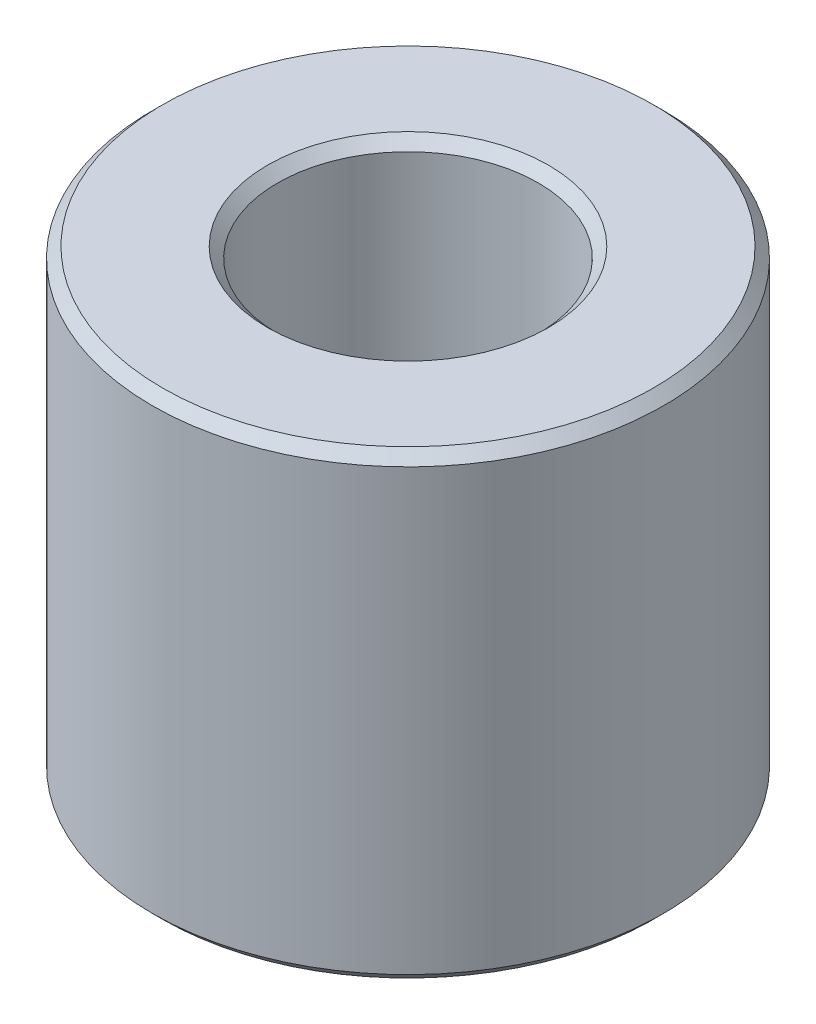
ISO-10303-21;
HEADER;
FILE_DESCRIPTION(('STEP AP214'),'2;1');
FILE_NAME('part.step','',(''),(''),'','','');
FILE_SCHEMA(('AUTOMOTIVE_DESIGN { 1 0 10303 214 1 1 1 1 }'));
ENDSEC;
DATA;
#1=APPLICATION_CONTEXT('core data for automotive mechanical design processes');
#2=APPLICATION_PROTOCOL_DEFINITION('international standard','automotive_design',2000,#1);
#3=PRODUCT_CONTEXT('',#1,'mechanical');
#4=PRODUCT('Part','Part','',(#3));
#5=PRODUCT_RELATED_PRODUCT_CATEGORY('part','',(#4));
#6=PRODUCT_DEFINITION_FORMATION('','',#4);
#7=PRODUCT_DEFINITION_CONTEXT('part definition',#1,'design');
#8=PRODUCT_DEFINITION('design','',#6,#7);
#9=PRODUCT_DEFINITION_SHAPE('','',#8);
#10=(LENGTH_UNIT() NAMED_UNIT(*) SI_UNIT(.MILLI.,.METRE.));
#11=(NAMED_UNIT(*) PLANE_ANGLE_UNIT() SI_UNIT($,.RADIAN.));
#12=(NAMED_UNIT(*) SI_UNIT($,.STERADIAN.) SOLID_ANGLE_UNIT());
#13=UNCERTAINTY_MEASURE_WITH_UNIT(LENGTH_MEASURE(1.E-05),#10,'distance_accuracy_value','');
#14=(GEOMETRIC_REPRESENTATION_CONTEXT(3) GLOBAL_UNCERTAINTY_ASSIGNED_CONTEXT((#13)) GLOBAL_UNIT_ASSIGNED_CONTEXT((#10,
#11,#12)) REPRESENTATION_CONTEXT('',''));
#15=CARTESIAN_POINT('',(0.,0.,0.));
#16=DIRECTION('',(0.,0.,1.));
#17=DIRECTION('',(1.,0.,0.));
#18=AXIS2_PLACEMENT_3D('',#15,#16,#17);
#19=CARTESIAN_POINT('',(0.,4.5,-2.75));
#20=DIRECTION('',(0.,-1.,0.));
#21=DIRECTION('',(0.,0.,-1.));
#22=AXIS2_PLACEMENT_3D('',#19,#20,#21);
#23=PLANE('',#22);
#24=CARTESIAN_POINT('',(0.,4.5,0.));
#25=DIRECTION('',(0.,1.,0.));
#26=DIRECTION('',(0.,0.,1.));
#27=AXIS2_PLACEMENT_3D('',#24,#25,#26);
#28=CIRCLE('',#27,2.75);
#29=CARTESIAN_POINT('',(0.,4.5,2.75));
#30=VERTEX_POINT('',#29);
#31=EDGE_CURVE('E67',#30,#30,#28,.T.);
#32=ORIENTED_EDGE('',*,*,#31,.F.);
#33=EDGE_LOOP('',(#32));
#34=FACE_BOUND('',#33,.T.);
#35=CARTESIAN_POINT('',(0.,4.5,0.));
#36=DIRECTION('',(0.,1.,0.));
#37=DIRECTION('',(0.,0.,1.));
#38=AXIS2_PLACEMENT_3D('',#35,#36,#37);
#39=CIRCLE('',#38,4.8);
#40=CARTESIAN_POINT('',(0.,4.5,4.8));
#41=VERTEX_POINT('',#40);
#42=EDGE_CURVE('E10',#41,#41,#39,.T.);
#43=ORIENTED_EDGE('',*,*,#42,.T.);
#44=EDGE_LOOP('',(#43));
#45=FACE_BOUND('',#44,.T.);
#46=ADVANCED_FACE('F39',(#34,#45),#23,.F.);
#47=CARTESIAN_POINT('',(0.,4.3,0.));
#48=DIRECTION('',(0.,-1.,0.));
#49=DIRECTION('',(0.,0.,-1.));
#50=AXIS2_PLACEMENT_3D('',#47,#48,#49);
#51=CONICAL_SURFACE('',#50,5.,0.785398163397446);
#52=ORIENTED_EDGE('',*,*,#42,.F.);
#53=EDGE_LOOP('',(#52));
#54=FACE_BOUND('',#53,.T.);
#55=CARTESIAN_POINT('',(0.,4.3,0.));
#56=DIRECTION('',(0.,1.,0.));
#57=DIRECTION('',(0.,0.,1.));
#58=AXIS2_PLACEMENT_3D('',#55,#56,#57);
#59=CIRCLE('',#58,5.);
#60=CARTESIAN_POINT('',(0.,4.3,5.));
#61=VERTEX_POINT('',#60);
#62=EDGE_CURVE('E45',#61,#61,#59,.T.);
#63=ORIENTED_EDGE('',*,*,#62,.T.);
#64=EDGE_LOOP('',(#63));
#65=FACE_BOUND('',#64,.T.);
#66=ADVANCED_FACE('F74',(#54,#65),#51,.T.);
#67=CARTESIAN_POINT('',(0.,2.13387096774193,0.));
#68=DIRECTION('',(0.,1.,0.));
#69=DIRECTION('',(0.,0.,1.));
#70=AXIS2_PLACEMENT_3D('',#67,#68,#69);
#71=CYLINDRICAL_SURFACE('',#70,5.);
#72=ORIENTED_EDGE('',*,*,#62,.F.);
#73=EDGE_LOOP('',(#72));
#74=FACE_BOUND('',#73,.T.);
#75=CARTESIAN_POINT('',(0.,-4.3,0.));
#76=DIRECTION('',(0.,1.,0.));
#77=DIRECTION('',(0.,0.,1.));
#78=AXIS2_PLACEMENT_3D('',#75,#76,#77);
#79=CIRCLE('',#78,5.);
#80=CARTESIAN_POINT('',(0.,-4.3,5.));
#81=VERTEX_POINT('',#80);
#82=EDGE_CURVE('E49',#81,#81,#79,.T.);
#83=ORIENTED_EDGE('',*,*,#82,.T.);
#84=EDGE_LOOP('',(#83));
#85=FACE_BOUND('',#84,.T.);
#86=ADVANCED_FACE('F78',(#74,#85),#71,.T.);
#87=CARTESIAN_POINT('',(0.,-4.5,0.));
#88=DIRECTION('',(0.,1.,0.));
#89=DIRECTION('',(0.,0.,1.));
#90=AXIS2_PLACEMENT_3D('',#87,#88,#89);
#91=CONICAL_SURFACE('',#90,4.8,0.78539816339745);
#92=ORIENTED_EDGE('',*,*,#82,.F.);
#93=EDGE_LOOP('',(#92));
#94=FACE_BOUND('',#93,.T.);
#95=CARTESIAN_POINT('',(0.,-4.5,0.));
#96=DIRECTION('',(0.,1.,0.));
#97=DIRECTION('',(0.,0.,1.));
#98=AXIS2_PLACEMENT_3D('',#95,#96,#97);
#99=CIRCLE('',#98,4.8);
#100=CARTESIAN_POINT('',(0.,-4.5,4.8));
#101=VERTEX_POINT('',#100);
#102=EDGE_CURVE('E53',#101,#101,#99,.T.);
#103=ORIENTED_EDGE('',*,*,#102,.T.);
#104=EDGE_LOOP('',(#103));
#105=FACE_BOUND('',#104,.T.);
#106=ADVANCED_FACE('F83',(#94,#105),#91,.T.);
#107=CARTESIAN_POINT('',(0.,-4.5,-2.75));
#108=DIRECTION('',(0.,1.,0.));
#109=DIRECTION('',(0.,0.,1.));
#110=AXIS2_PLACEMENT_3D('',#107,#108,#109);
#111=PLANE('',#110);
#112=ORIENTED_EDGE('',*,*,#102,.F.);
#113=EDGE_LOOP('',(#112));
#114=FACE_BOUND('',#113,.T.);
#115=CARTESIAN_POINT('',(0.,-4.5,0.));
#116=DIRECTION('',(0.,1.,0.));
#117=DIRECTION('',(0.,0.,1.));
#118=AXIS2_PLACEMENT_3D('',#115,#116,#117);
#119=CIRCLE('',#118,2.75);
#120=CARTESIAN_POINT('',(0.,-4.5,2.75));
#121=VERTEX_POINT('',#120);
#122=EDGE_CURVE('E58',#121,#121,#119,.T.);
#123=ORIENTED_EDGE('',*,*,#122,.T.);
#124=EDGE_LOOP('',(#123));
#125=FACE_BOUND('',#124,.T.);
#126=ADVANCED_FACE('F89',(#114,#125),#111,.F.);
#127=CARTESIAN_POINT('',(0.,-4.3,0.));
#128=DIRECTION('',(0.,-1.,0.));
#129=DIRECTION('',(0.,0.,-1.));
#130=AXIS2_PLACEMENT_3D('',#127,#128,#129);
#131=CONICAL_SURFACE('',#130,2.55,0.785398163397452);
#132=ORIENTED_EDGE('',*,*,#122,.F.);
#133=EDGE_LOOP('',(#132));
#134=FACE_BOUND('',#133,.T.);
#135=CARTESIAN_POINT('',(0.,-4.3,0.));
#136=DIRECTION('',(0.,1.,0.));
#137=DIRECTION('',(0.,0.,1.));
#138=AXIS2_PLACEMENT_3D('',#135,#136,#137);
#139=CIRCLE('',#138,2.55);
#140=CARTESIAN_POINT('',(0.,-4.3,2.55));
#141=VERTEX_POINT('',#140);
#142=EDGE_CURVE('E61',#141,#141,#139,.T.);
#143=ORIENTED_EDGE('',*,*,#142,.T.);
#144=EDGE_LOOP('',(#143));
#145=FACE_BOUND('',#144,.T.);
#146=ADVANCED_FACE('F93',(#134,#145),#131,.F.);
#147=CARTESIAN_POINT('',(0.,2.13387096774193,0.));
#148=DIRECTION('',(0.,1.,0.));
#149=DIRECTION('',(0.,0.,1.));
#150=AXIS2_PLACEMENT_3D('',#147,#148,#149);
#151=CYLINDRICAL_SURFACE('',#150,2.55);
#152=ORIENTED_EDGE('',*,*,#142,.F.);
#153=EDGE_LOOP('',(#152));
#154=FACE_BOUND('',#153,.T.);
#155=CARTESIAN_POINT('',(0.,4.3,0.));
#156=DIRECTION('',(0.,1.,0.));
#157=DIRECTION('',(0.,0.,1.));
#158=AXIS2_PLACEMENT_3D('',#155,#156,#157);
#159=CIRCLE('',#158,2.55);
#160=CARTESIAN_POINT('',(0.,4.3,2.55));
#161=VERTEX_POINT('',#160);
#162=EDGE_CURVE('E64',#161,#161,#159,.T.);
#163=ORIENTED_EDGE('',*,*,#162,.T.);
#164=EDGE_LOOP('',(#163));
#165=FACE_BOUND('',#164,.T.);
#166=ADVANCED_FACE('F97',(#154,#165),#151,.F.);
#167=CARTESIAN_POINT('',(0.,4.5,0.));
#168=DIRECTION('',(0.,1.,0.));
#169=DIRECTION('',(0.,0.,1.));
#170=AXIS2_PLACEMENT_3D('',#167,#168,#169);
#171=CONICAL_SURFACE('',#170,2.75,0.785398163397447);
#172=ORIENTED_EDGE('',*,*,#162,.F.);
#173=EDGE_LOOP('',(#172));
#174=FACE_BOUND('',#173,.T.);
#175=ORIENTED_EDGE('',*,*,#31,.T.);
#176=EDGE_LOOP('',(#175));
#177=FACE_BOUND('',#176,.T.);
#178=ADVANCED_FACE('F71',(#174,#177),#171,.F.);
#179=CLOSED_SHELL('',(#46,#66,#86,#106,#126,#146,#166,#178));
#180=MANIFOLD_SOLID_BREP('B2',#179);
#181=ADVANCED_BREP_SHAPE_REPRESENTATION('',(#18,#180),#14);
#182=SHAPE_DEFINITION_REPRESENTATION(#9,#181);
ENDSEC;
END-ISO-10303-21;
